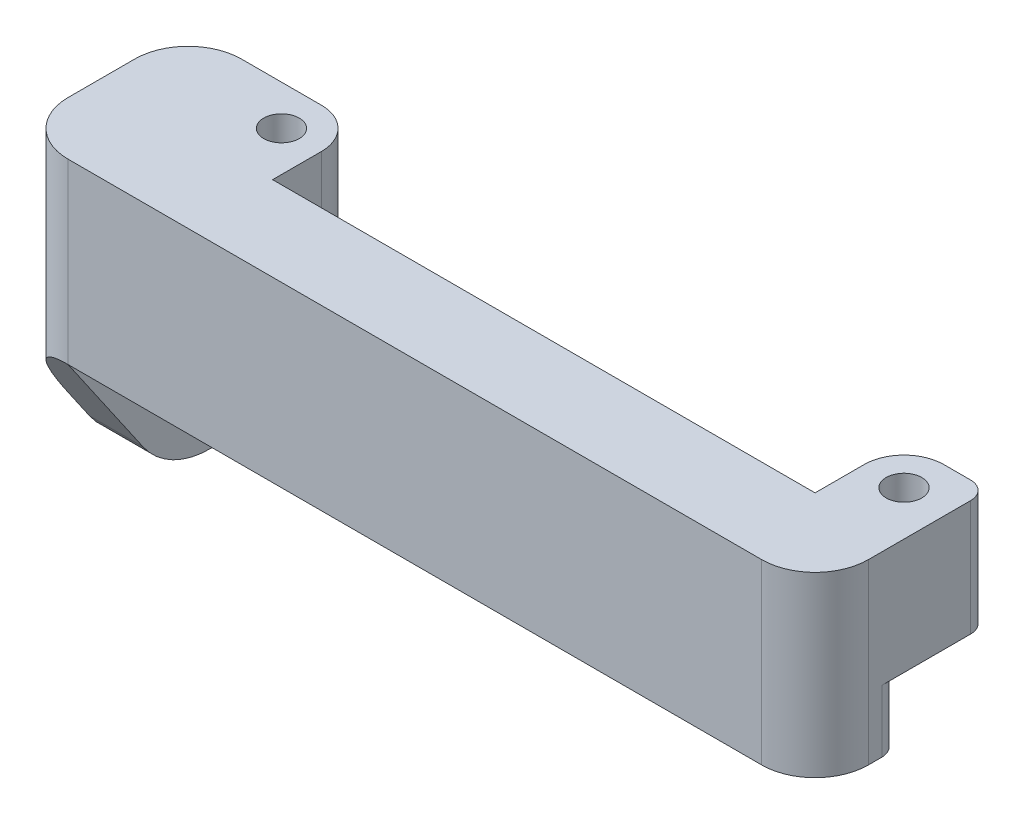
ISO-10303-21;
HEADER;
FILE_DESCRIPTION(('STEP AP214'),'2;1');
FILE_NAME('part.step','',(''),(''),'','','');
FILE_SCHEMA(('AUTOMOTIVE_DESIGN { 1 0 10303 214 1 1 1 1 }'));
ENDSEC;
DATA;
#1=APPLICATION_CONTEXT('core data for automotive mechanical design processes');
#2=APPLICATION_PROTOCOL_DEFINITION('international standard','automotive_design',2000,#1);
#3=PRODUCT_CONTEXT('',#1,'mechanical');
#4=PRODUCT('Part','Part','',(#3));
#5=PRODUCT_RELATED_PRODUCT_CATEGORY('part','',(#4));
#6=PRODUCT_DEFINITION_FORMATION('','',#4);
#7=PRODUCT_DEFINITION_CONTEXT('part definition',#1,'design');
#8=PRODUCT_DEFINITION('design','',#6,#7);
#9=PRODUCT_DEFINITION_SHAPE('','',#8);
#10=(LENGTH_UNIT() NAMED_UNIT(*) SI_UNIT(.MILLI.,.METRE.));
#11=(NAMED_UNIT(*) PLANE_ANGLE_UNIT() SI_UNIT($,.RADIAN.));
#12=(NAMED_UNIT(*) SI_UNIT($,.STERADIAN.) SOLID_ANGLE_UNIT());
#13=UNCERTAINTY_MEASURE_WITH_UNIT(LENGTH_MEASURE(1.E-05),#10,'distance_accuracy_value','');
#14=(GEOMETRIC_REPRESENTATION_CONTEXT(3) GLOBAL_UNCERTAINTY_ASSIGNED_CONTEXT((#13)) GLOBAL_UNIT_ASSIGNED_CONTEXT((#10,
#11,#12)) REPRESENTATION_CONTEXT('',''));
#15=CARTESIAN_POINT('',(0.,0.,0.));
#16=DIRECTION('',(0.,0.,1.));
#17=DIRECTION('',(1.,0.,0.));
#18=AXIS2_PLACEMENT_3D('',#15,#16,#17);
#19=CARTESIAN_POINT('',(0.,0.,2.75));
#20=DIRECTION('',(0.,0.,-1.));
#21=DIRECTION('',(0.,1.,0.));
#22=AXIS2_PLACEMENT_3D('',#19,#20,#21);
#23=PLANE('',#22);
#24=DIRECTION('',(-1.,0.,0.));
#25=VECTOR('',#24,1.);
#26=CARTESIAN_POINT('',(15.25,0.,2.75));
#27=LINE('',#26,#25);
#28=CARTESIAN_POINT('',(19.,0.,2.75));
#29=VERTEX_POINT('',#28);
#30=CARTESIAN_POINT('',(15.25,0.,2.75));
#31=VERTEX_POINT('',#30);
#32=EDGE_CURVE('E187',#29,#31,#27,.T.);
#33=ORIENTED_EDGE('',*,*,#32,.F.);
#34=DIRECTION('',(0.,1.,0.));
#35=VECTOR('',#34,1.);
#36=CARTESIAN_POINT('',(19.,-3.50000000000002,2.75));
#37=LINE('',#36,#35);
#38=CARTESIAN_POINT('',(19.,-3.5,2.75));
#39=VERTEX_POINT('',#38);
#40=EDGE_CURVE('E253',#29,#39,#37,.F.);
#41=ORIENTED_EDGE('',*,*,#40,.T.);
#42=DIRECTION('',(-1.,0.,0.));
#43=VECTOR('',#42,1.);
#44=CARTESIAN_POINT('',(-15.25,-3.5,2.75));
#45=LINE('',#44,#43);
#46=CARTESIAN_POINT('',(-22.,-3.5,2.75));
#47=VERTEX_POINT('',#46);
#48=EDGE_CURVE('E202',#39,#47,#45,.T.);
#49=ORIENTED_EDGE('',*,*,#48,.T.);
#50=DIRECTION('',(0.,1.,0.));
#51=VECTOR('',#50,1.);
#52=CARTESIAN_POINT('',(-22.,-3.5,2.75));
#53=LINE('',#52,#51);
#54=CARTESIAN_POINT('',(-22.,0.,2.75));
#55=VERTEX_POINT('',#54);
#56=EDGE_CURVE('E204',#47,#55,#53,.T.);
#57=ORIENTED_EDGE('',*,*,#56,.T.);
#58=DIRECTION('',(1.,0.,0.));
#59=VECTOR('',#58,1.);
#60=CARTESIAN_POINT('',(-22.,0.,2.75));
#61=LINE('',#60,#59);
#62=CARTESIAN_POINT('',(-15.25,0.,2.75));
#63=VERTEX_POINT('',#62);
#64=EDGE_CURVE('E196',#55,#63,#61,.T.);
#65=ORIENTED_EDGE('',*,*,#64,.T.);
#66=DIRECTION('',(0.,1.,0.));
#67=VECTOR('',#66,1.);
#68=CARTESIAN_POINT('',(-15.25,6.5,2.75));
#69=LINE('',#68,#67);
#70=CARTESIAN_POINT('',(-15.25,6.5,2.75));
#71=VERTEX_POINT('',#70);
#72=EDGE_CURVE('E191',#63,#71,#69,.T.);
#73=ORIENTED_EDGE('',*,*,#72,.T.);
#74=DIRECTION('',(-1.,0.,0.));
#75=VECTOR('',#74,1.);
#76=CARTESIAN_POINT('',(20.,6.49999999999998,2.75));
#77=LINE('',#76,#75);
#78=CARTESIAN_POINT('',(15.25,6.5,2.75));
#79=VERTEX_POINT('',#78);
#80=EDGE_CURVE('E170',#79,#71,#77,.T.);
#81=ORIENTED_EDGE('',*,*,#80,.F.);
#82=DIRECTION('',(0.,1.,0.));
#83=VECTOR('',#82,1.);
#84=CARTESIAN_POINT('',(15.25,6.5,2.75));
#85=LINE('',#84,#83);
#86=EDGE_CURVE('E180',#31,#79,#85,.T.);
#87=ORIENTED_EDGE('',*,*,#86,.F.);
#88=EDGE_LOOP('',(#33,#41,#49,#57,#65,#73,#81,#87));
#89=FACE_BOUND('',#88,.T.);
#90=ADVANCED_FACE('F33',(#89),#23,.T.);
#91=CARTESIAN_POINT('',(-15.25,0.,0.));
#92=DIRECTION('',(-1.,0.,0.));
#93=DIRECTION('',(0.,0.,1.));
#94=AXIS2_PLACEMENT_3D('',#91,#92,#93);
#95=PLANE('',#94);
#96=DIRECTION('',(0.,0.,-1.));
#97=VECTOR('',#96,1.);
#98=CARTESIAN_POINT('',(-15.25,0.,2.75));
#99=LINE('',#98,#97);
#100=CARTESIAN_POINT('',(-15.25,0.,0.));
#101=VERTEX_POINT('',#100);
#102=EDGE_CURVE('E206',#63,#101,#99,.T.);
#103=ORIENTED_EDGE('',*,*,#102,.T.);
#104=DIRECTION('',(0.,1.,0.));
#105=VECTOR('',#104,1.);
#106=CARTESIAN_POINT('',(-15.25,6.5,0.));
#107=LINE('',#106,#105);
#108=CARTESIAN_POINT('',(-15.25,6.5,0.));
#109=VERTEX_POINT('',#108);
#110=EDGE_CURVE('E278',#101,#109,#107,.T.);
#111=ORIENTED_EDGE('',*,*,#110,.T.);
#112=DIRECTION('',(0.,0.,1.));
#113=VECTOR('',#112,1.);
#114=CARTESIAN_POINT('',(-15.25,6.5,7.5));
#115=LINE('',#114,#113);
#116=EDGE_CURVE('E214',#109,#71,#115,.T.);
#117=ORIENTED_EDGE('',*,*,#116,.T.);
#118=ORIENTED_EDGE('',*,*,#72,.F.);
#119=EDGE_LOOP('',(#103,#111,#117,#118));
#120=FACE_BOUND('',#119,.T.);
#121=ADVANCED_FACE('F335',(#120),#95,.F.);
#122=CARTESIAN_POINT('',(-15.25,-3.5,-2.25));
#123=DIRECTION('',(0.,1.,0.));
#124=DIRECTION('',(0.,0.,1.));
#125=AXIS2_PLACEMENT_3D('',#122,#123,#124);
#126=PLANE('',#125);
#127=DIRECTION('',(0.,0.,-1.));
#128=VECTOR('',#127,1.);
#129=CARTESIAN_POINT('',(20.,-3.50000000000002,2.75));
#130=LINE('',#129,#128);
#131=CARTESIAN_POINT('',(20.,-3.50000000000002,4.5));
#132=VERTEX_POINT('',#131);
#133=CARTESIAN_POINT('',(20.,-3.50000000000002,3.75));
#134=VERTEX_POINT('',#133);
#135=EDGE_CURVE('E193',#132,#134,#130,.T.);
#136=ORIENTED_EDGE('',*,*,#135,.F.);
#137=CARTESIAN_POINT('',(17.,-3.5,4.5));
#138=DIRECTION('',(0.,1.,0.));
#139=DIRECTION('',(0.,0.,1.));
#140=AXIS2_PLACEMENT_3D('',#137,#138,#139);
#141=CIRCLE('',#140,3.);
#142=CARTESIAN_POINT('',(17.,-3.5,7.5));
#143=VERTEX_POINT('',#142);
#144=EDGE_CURVE('E288',#132,#143,#141,.F.);
#145=ORIENTED_EDGE('',*,*,#144,.T.);
#146=DIRECTION('',(-1.,0.,0.));
#147=VECTOR('',#146,1.);
#148=CARTESIAN_POINT('',(-15.25,-3.5,7.5));
#149=LINE('',#148,#147);
#150=CARTESIAN_POINT('',(-22.,-3.5,7.5));
#151=VERTEX_POINT('',#150);
#152=EDGE_CURVE('E216',#143,#151,#149,.T.);
#153=ORIENTED_EDGE('',*,*,#152,.T.);
#154=DIRECTION('',(0.,0.,-1.));
#155=VECTOR('',#154,1.);
#156=CARTESIAN_POINT('',(-22.,-3.5,-2.25));
#157=LINE('',#156,#155);
#158=EDGE_CURVE('E211',#151,#47,#157,.T.);
#159=ORIENTED_EDGE('',*,*,#158,.T.);
#160=ORIENTED_EDGE('',*,*,#48,.F.);
#161=CARTESIAN_POINT('',(19.,-3.5,3.75));
#162=DIRECTION('',(0.,1.,0.));
#163=DIRECTION('',(0.,0.,1.));
#164=AXIS2_PLACEMENT_3D('',#161,#162,#163);
#165=CIRCLE('',#164,1.);
#166=EDGE_CURVE('E255',#39,#134,#165,.F.);
#167=ORIENTED_EDGE('',*,*,#166,.T.);
#168=EDGE_LOOP('',(#136,#145,#153,#159,#160,#167));
#169=FACE_BOUND('',#168,.T.);
#170=ADVANCED_FACE('F340',(#169),#126,.F.);
#171=CARTESIAN_POINT('',(-22.,-7.,-0.5));
#172=DIRECTION('',(-1.,0.,0.));
#173=DIRECTION('',(0.,0.,1.));
#174=AXIS2_PLACEMENT_3D('',#171,#172,#173);
#175=PLANE('',#174);
#176=CARTESIAN_POINT('',(-22.,-7.,-0.5));
#177=DIRECTION('',(1.,0.,0.));
#178=DIRECTION('',(0.,0.,-1.));
#179=AXIS2_PLACEMENT_3D('',#176,#177,#178);
#180=CIRCLE('',#179,1.59999999999999);
#181=CARTESIAN_POINT('',(-22.,-7.,-2.09999999999999));
#182=VERTEX_POINT('',#181);
#183=EDGE_CURVE('E431',#182,#182,#180,.T.);
#184=ORIENTED_EDGE('',*,*,#183,.F.);
#185=EDGE_LOOP('',(#184));
#186=FACE_BOUND('',#185,.T.);
#187=DIRECTION('',(0.,-0.902050649941539,-0.431630194657473));
#188=VECTOR('',#187,1.);
#189=CARTESIAN_POINT('',(-22.,0.,-2.25));
#190=LINE('',#189,#188);
#191=CARTESIAN_POINT('',(-22.,0.,-2.25));
#192=VERTEX_POINT('',#191);
#193=CARTESIAN_POINT('',(-22.,-5.01450110457563,-4.64943298973108));
#194=VERTEX_POINT('',#193);
#195=EDGE_CURVE('E222',#192,#194,#190,.T.);
#196=ORIENTED_EDGE('',*,*,#195,.F.);
#197=DIRECTION('',(0.,0.,-1.));
#198=VECTOR('',#197,1.);
#199=CARTESIAN_POINT('',(-22.,0.,2.75));
#200=LINE('',#199,#198);
#201=EDGE_CURVE('E208',#55,#192,#200,.T.);
#202=ORIENTED_EDGE('',*,*,#201,.F.);
#203=ORIENTED_EDGE('',*,*,#56,.F.);
#204=ORIENTED_EDGE('',*,*,#158,.F.);
#205=DIRECTION('',(0.,0.823317027142543,0.567581776325813));
#206=VECTOR('',#205,1.);
#207=CARTESIAN_POINT('',(-22.,-9.61087617109874,3.2872583248557));
#208=LINE('',#207,#206);
#209=CARTESIAN_POINT('',(-22.,-9.61087617109874,3.2872583248557));
#210=VERTEX_POINT('',#209);
#211=EDGE_CURVE('E229',#210,#151,#208,.T.);
#212=ORIENTED_EDGE('',*,*,#211,.F.);
#213=CARTESIAN_POINT('',(-22.,-7.,-0.5));
#214=DIRECTION('',(-1.,0.,0.));
#215=DIRECTION('',(0.,0.,1.));
#216=AXIS2_PLACEMENT_3D('',#213,#214,#215);
#217=CIRCLE('',#216,4.6);
#218=EDGE_CURVE('E225',#194,#210,#217,.T.);
#219=ORIENTED_EDGE('',*,*,#218,.F.);
#220=EDGE_LOOP('',(#196,#202,#203,#204,#212,#219));
#221=FACE_BOUND('',#220,.T.);
#222=ADVANCED_FACE('F353',(#186,#221),#175,.F.);
#223=CARTESIAN_POINT('',(-22.,6.5,7.5));
#224=DIRECTION('',(0.,1.,0.));
#225=DIRECTION('',(0.,0.,1.));
#226=AXIS2_PLACEMENT_3D('',#223,#224,#225);
#227=PLANE('',#226);
#228=CARTESIAN_POINT('',(17.5,6.50000000000001,0.));
#229=DIRECTION('',(0.,-1.,0.));
#230=DIRECTION('',(0.,0.,-1.));
#231=AXIS2_PLACEMENT_3D('',#228,#229,#230);
#232=CIRCLE('',#231,0.999999999999987);
#233=CARTESIAN_POINT('',(17.5,6.50000000000001,-0.999999999999987));
#234=VERTEX_POINT('',#233);
#235=EDGE_CURVE('E422',#234,#234,#232,.T.);
#236=ORIENTED_EDGE('',*,*,#235,.T.);
#237=EDGE_LOOP('',(#236));
#238=FACE_BOUND('',#237,.T.);
#239=CARTESIAN_POINT('',(-17.5,6.50000000000001,0.));
#240=DIRECTION('',(0.,-1.,0.));
#241=DIRECTION('',(0.,0.,-1.));
#242=AXIS2_PLACEMENT_3D('',#239,#240,#241);
#243=CIRCLE('',#242,0.999999999999987);
#244=CARTESIAN_POINT('',(-17.5,6.50000000000001,-0.999999999999987));
#245=VERTEX_POINT('',#244);
#246=EDGE_CURVE('E188',#245,#245,#243,.T.);
#247=ORIENTED_EDGE('',*,*,#246,.T.);
#248=EDGE_LOOP('',(#247));
#249=FACE_BOUND('',#248,.T.);
#250=DIRECTION('',(-1.,0.,0.));
#251=VECTOR('',#250,1.);
#252=CARTESIAN_POINT('',(-22.,6.5,7.5));
#253=LINE('',#252,#251);
#254=CARTESIAN_POINT('',(17.,6.5,7.5));
#255=VERTEX_POINT('',#254);
#256=CARTESIAN_POINT('',(-22.,6.5,7.5));
#257=VERTEX_POINT('',#256);
#258=EDGE_CURVE('E239',#255,#257,#253,.T.);
#259=ORIENTED_EDGE('',*,*,#258,.F.);
#260=CARTESIAN_POINT('',(17.,6.5,4.5));
#261=DIRECTION('',(0.,1.,0.));
#262=DIRECTION('',(0.,0.,1.));
#263=AXIS2_PLACEMENT_3D('',#260,#261,#262);
#264=CIRCLE('',#263,3.);
#265=CARTESIAN_POINT('',(20.,6.49999999999998,4.5));
#266=VERTEX_POINT('',#265);
#267=EDGE_CURVE('E298',#255,#266,#264,.T.);
#268=ORIENTED_EDGE('',*,*,#267,.T.);
#269=DIRECTION('',(0.,0.,1.));
#270=VECTOR('',#269,1.);
#271=CARTESIAN_POINT('',(20.,6.49999999999998,7.5));
#272=LINE('',#271,#270);
#273=CARTESIAN_POINT('',(20.,6.49999999999998,-1.25));
#274=VERTEX_POINT('',#273);
#275=EDGE_CURVE('E176',#274,#266,#272,.T.);
#276=ORIENTED_EDGE('',*,*,#275,.F.);
#277=CARTESIAN_POINT('',(19.,6.5,-1.25));
#278=DIRECTION('',(0.,1.,0.));
#279=DIRECTION('',(0.,0.,1.));
#280=AXIS2_PLACEMENT_3D('',#277,#278,#279);
#281=CIRCLE('',#280,1.);
#282=CARTESIAN_POINT('',(19.,6.5,-2.25));
#283=VERTEX_POINT('',#282);
#284=EDGE_CURVE('E263',#274,#283,#281,.T.);
#285=ORIENTED_EDGE('',*,*,#284,.T.);
#286=DIRECTION('',(1.,0.,0.));
#287=VECTOR('',#286,1.);
#288=CARTESIAN_POINT('',(20.,6.5,-2.25));
#289=LINE('',#288,#287);
#290=CARTESIAN_POINT('',(17.5,6.5,-2.25));
#291=VERTEX_POINT('',#290);
#292=EDGE_CURVE('E412',#291,#283,#289,.T.);
#293=ORIENTED_EDGE('',*,*,#292,.F.);
#294=CARTESIAN_POINT('',(17.5,6.5,0.));
#295=DIRECTION('',(0.,1.,0.));
#296=DIRECTION('',(0.,0.,1.));
#297=AXIS2_PLACEMENT_3D('',#294,#295,#296);
#298=CIRCLE('',#297,2.25);
#299=CARTESIAN_POINT('',(15.25,6.5,0.));
#300=VERTEX_POINT('',#299);
#301=EDGE_CURVE('E173',#291,#300,#298,.T.);
#302=ORIENTED_EDGE('',*,*,#301,.T.);
#303=DIRECTION('',(0.,0.,1.));
#304=VECTOR('',#303,1.);
#305=CARTESIAN_POINT('',(15.25,6.5,-2.25));
#306=LINE('',#305,#304);
#307=EDGE_CURVE('E164',#300,#79,#306,.T.);
#308=ORIENTED_EDGE('',*,*,#307,.T.);
#309=ORIENTED_EDGE('',*,*,#80,.T.);
#310=ORIENTED_EDGE('',*,*,#116,.F.);
#311=CARTESIAN_POINT('',(-17.5,6.5,0.));
#312=DIRECTION('',(0.,1.,0.));
#313=DIRECTION('',(0.,0.,1.));
#314=AXIS2_PLACEMENT_3D('',#311,#312,#313);
#315=CIRCLE('',#314,2.25);
#316=CARTESIAN_POINT('',(-17.5,6.5,-2.25));
#317=VERTEX_POINT('',#316);
#318=EDGE_CURVE('E271',#109,#317,#315,.T.);
#319=ORIENTED_EDGE('',*,*,#318,.T.);
#320=DIRECTION('',(-1.,0.,0.));
#321=VECTOR('',#320,1.);
#322=CARTESIAN_POINT('',(-22.,6.5,-2.25));
#323=LINE('',#322,#321);
#324=CARTESIAN_POINT('',(-22.,6.5,-2.25));
#325=VERTEX_POINT('',#324);
#326=EDGE_CURVE('E231',#317,#325,#323,.T.);
#327=ORIENTED_EDGE('',*,*,#326,.T.);
#328=CARTESIAN_POINT('',(-22.,6.5,0.750000000000001));
#329=DIRECTION('',(0.,1.,0.));
#330=DIRECTION('',(0.,0.,1.));
#331=AXIS2_PLACEMENT_3D('',#328,#329,#330);
#332=CIRCLE('',#331,3.);
#333=CARTESIAN_POINT('',(-25.,6.5,0.750000000000001));
#334=VERTEX_POINT('',#333);
#335=EDGE_CURVE('E296',#325,#334,#332,.T.);
#336=ORIENTED_EDGE('',*,*,#335,.T.);
#337=DIRECTION('',(0.,0.,-1.));
#338=VECTOR('',#337,1.);
#339=CARTESIAN_POINT('',(-25.,6.5,7.5));
#340=LINE('',#339,#338);
#341=CARTESIAN_POINT('',(-25.,6.5,4.5));
#342=VERTEX_POINT('',#341);
#343=EDGE_CURVE('E221',#342,#334,#340,.T.);
#344=ORIENTED_EDGE('',*,*,#343,.F.);
#345=CARTESIAN_POINT('',(-22.,6.5,4.5));
#346=DIRECTION('',(0.,1.,0.));
#347=DIRECTION('',(0.,0.,1.));
#348=AXIS2_PLACEMENT_3D('',#345,#346,#347);
#349=CIRCLE('',#348,3.);
#350=EDGE_CURVE('E294',#342,#257,#349,.T.);
#351=ORIENTED_EDGE('',*,*,#350,.T.);
#352=EDGE_LOOP('',(#259,#268,#276,#285,#293,#302,#308,#309,#310,#319,#327,#336,#344,#351));
#353=FACE_BOUND('',#352,.T.);
#354=ADVANCED_FACE('F167',(#238,#249,#353),#227,.T.);
#355=CARTESIAN_POINT('',(-22.,-3.5,7.5));
#356=DIRECTION('',(0.,0.,1.));
#357=DIRECTION('',(0.,-1.,0.));
#358=AXIS2_PLACEMENT_3D('',#355,#356,#357);
#359=PLANE('',#358);
#360=ORIENTED_EDGE('',*,*,#152,.F.);
#361=DIRECTION('',(0.,-1.,0.));
#362=VECTOR('',#361,1.);
#363=CARTESIAN_POINT('',(17.,6.49999999999998,7.5));
#364=LINE('',#363,#362);
#365=EDGE_CURVE('E292',#143,#255,#364,.F.);
#366=ORIENTED_EDGE('',*,*,#365,.T.);
#367=ORIENTED_EDGE('',*,*,#258,.T.);
#368=DIRECTION('',(0.,1.,0.));
#369=VECTOR('',#368,1.);
#370=CARTESIAN_POINT('',(-22.,-3.5,7.5));
#371=LINE('',#370,#369);
#372=EDGE_CURVE('E290',#257,#151,#371,.F.);
#373=ORIENTED_EDGE('',*,*,#372,.T.);
#374=EDGE_LOOP('',(#360,#366,#367,#373));
#375=FACE_BOUND('',#374,.T.);
#376=ADVANCED_FACE('F327',(#375),#359,.T.);
#377=CARTESIAN_POINT('',(-22.,-9.61087617109874,3.2872583248557));
#378=DIRECTION('',(0.,-0.567581776325813,0.823317027142543));
#379=DIRECTION('',(0.,-0.823317027142543,-0.567581776325813));
#380=AXIS2_PLACEMENT_3D('',#377,#378,#379);
#381=PLANE('',#380);
#382=ORIENTED_EDGE('',*,*,#211,.T.);
#383=CARTESIAN_POINT('',(-22.,-7.85170962925665,4.5));
#384=DIRECTION('',(0.,-0.567581776325813,0.823317027142543));
#385=DIRECTION('',(0.,0.823317027142543,0.567581776325813));
#386=AXIS2_PLACEMENT_3D('',#383,#384,#385);
#387=ELLIPSE('',#386,5.2855819639246,3.);
#388=CARTESIAN_POINT('',(-25.,-7.85170962925665,4.5));
#389=VERTEX_POINT('',#388);
#390=EDGE_CURVE('E41',#151,#389,#387,.T.);
#391=ORIENTED_EDGE('',*,*,#390,.T.);
#392=DIRECTION('',(0.,0.823317027142543,0.567581776325813));
#393=VECTOR('',#392,1.);
#394=CARTESIAN_POINT('',(-25.,-9.61087617109874,3.2872583248557));
#395=LINE('',#394,#393);
#396=CARTESIAN_POINT('',(-25.,-9.61087617109874,3.2872583248557));
#397=VERTEX_POINT('',#396);
#398=EDGE_CURVE('E226',#397,#389,#395,.T.);
#399=ORIENTED_EDGE('',*,*,#398,.F.);
#400=DIRECTION('',(-1.,0.,0.));
#401=VECTOR('',#400,1.);
#402=CARTESIAN_POINT('',(-22.,-9.61087617109874,3.2872583248557));
#403=LINE('',#402,#401);
#404=EDGE_CURVE('E242',#210,#397,#403,.T.);
#405=ORIENTED_EDGE('',*,*,#404,.F.);
#406=EDGE_LOOP('',(#382,#391,#399,#405));
#407=FACE_BOUND('',#406,.T.);
#408=ADVANCED_FACE('F363',(#407),#381,.T.);
#409=CARTESIAN_POINT('',(-22.,-7.,-0.5));
#410=DIRECTION('',(-1.,0.,0.));
#411=DIRECTION('',(0.,0.,1.));
#412=AXIS2_PLACEMENT_3D('',#409,#410,#411);
#413=CYLINDRICAL_SURFACE('',#412,4.6);
#414=CARTESIAN_POINT('',(-25.,-7.,-0.5));
#415=DIRECTION('',(-1.,0.,0.));
#416=DIRECTION('',(0.,0.,1.));
#417=AXIS2_PLACEMENT_3D('',#414,#415,#416);
#418=CIRCLE('',#417,4.6);
#419=CARTESIAN_POINT('',(-25.,-5.01450110457563,-4.64943298973108));
#420=VERTEX_POINT('',#419);
#421=EDGE_CURVE('E235',#420,#397,#418,.T.);
#422=ORIENTED_EDGE('',*,*,#421,.F.);
#423=DIRECTION('',(-1.,0.,0.));
#424=VECTOR('',#423,1.);
#425=CARTESIAN_POINT('',(-22.,-5.01450110457563,-4.64943298973108));
#426=LINE('',#425,#424);
#427=EDGE_CURVE('E244',#194,#420,#426,.T.);
#428=ORIENTED_EDGE('',*,*,#427,.F.);
#429=ORIENTED_EDGE('',*,*,#218,.T.);
#430=ORIENTED_EDGE('',*,*,#404,.T.);
#431=EDGE_LOOP('',(#422,#428,#429,#430));
#432=FACE_BOUND('',#431,.T.);
#433=ADVANCED_FACE('F366',(#432),#413,.T.);
#434=CARTESIAN_POINT('',(-22.,0.,-2.25));
#435=DIRECTION('',(0.,0.431630194657473,-0.902050649941539));
#436=DIRECTION('',(0.,0.902050649941539,0.431630194657473));
#437=AXIS2_PLACEMENT_3D('',#434,#435,#436);
#438=PLANE('',#437);
#439=DIRECTION('',(0.,-0.902050649941539,-0.431630194657473));
#440=VECTOR('',#439,1.);
#441=CARTESIAN_POINT('',(-25.,0.,-2.25));
#442=LINE('',#441,#440);
#443=CARTESIAN_POINT('',(-25.,6.26960760234147,0.750000000000002));
#444=VERTEX_POINT('',#443);
#445=EDGE_CURVE('E47',#444,#420,#442,.T.);
#446=ORIENTED_EDGE('',*,*,#445,.F.);
#447=CARTESIAN_POINT('',(-22.,6.26960760234147,0.750000000000001));
#448=DIRECTION('',(0.,0.431630194657473,-0.902050649941539));
#449=DIRECTION('',(0.,-0.902050649941539,-0.431630194657473));
#450=AXIS2_PLACEMENT_3D('',#447,#448,#449);
#451=ELLIPSE('',#450,6.95039419654295,3.);
#452=EDGE_CURVE('E11',#444,#192,#451,.F.);
#453=ORIENTED_EDGE('',*,*,#452,.T.);
#454=ORIENTED_EDGE('',*,*,#195,.T.);
#455=ORIENTED_EDGE('',*,*,#427,.T.);
#456=EDGE_LOOP('',(#446,#453,#454,#455));
#457=FACE_BOUND('',#456,.T.);
#458=ADVANCED_FACE('F369',(#457),#438,.T.);
#459=CARTESIAN_POINT('',(-22.,6.5,-2.25));
#460=DIRECTION('',(0.,0.,-1.));
#461=DIRECTION('',(0.,1.,0.));
#462=AXIS2_PLACEMENT_3D('',#459,#460,#461);
#463=PLANE('',#462);
#464=DIRECTION('',(1.,0.,0.));
#465=VECTOR('',#464,1.);
#466=CARTESIAN_POINT('',(-22.,0.,-2.25));
#467=LINE('',#466,#465);
#468=CARTESIAN_POINT('',(-17.5,0.,-2.25));
#469=VERTEX_POINT('',#468);
#470=EDGE_CURVE('E192',#192,#469,#467,.T.);
#471=ORIENTED_EDGE('',*,*,#470,.F.);
#472=DIRECTION('',(0.,-1.,0.));
#473=VECTOR('',#472,1.);
#474=CARTESIAN_POINT('',(-22.,6.5,-2.25));
#475=LINE('',#474,#473);
#476=EDGE_CURVE('E306',#192,#325,#475,.F.);
#477=ORIENTED_EDGE('',*,*,#476,.T.);
#478=ORIENTED_EDGE('',*,*,#326,.F.);
#479=DIRECTION('',(0.,1.,0.));
#480=VECTOR('',#479,1.);
#481=CARTESIAN_POINT('',(-17.5,0.,-2.25));
#482=LINE('',#481,#480);
#483=EDGE_CURVE('E281',#317,#469,#482,.F.);
#484=ORIENTED_EDGE('',*,*,#483,.T.);
#485=EDGE_LOOP('',(#471,#477,#478,#484));
#486=FACE_BOUND('',#485,.T.);
#487=ADVANCED_FACE('F311',(#486),#463,.T.);
#488=CARTESIAN_POINT('',(-25.,-7.,-0.5));
#489=DIRECTION('',(-1.,0.,0.));
#490=DIRECTION('',(0.,0.,1.));
#491=AXIS2_PLACEMENT_3D('',#488,#489,#490);
#492=PLANE('',#491);
#493=CARTESIAN_POINT('',(-25.,-7.,-0.5));
#494=DIRECTION('',(1.,0.,0.));
#495=DIRECTION('',(0.,0.,-1.));
#496=AXIS2_PLACEMENT_3D('',#493,#494,#495);
#497=CIRCLE('',#496,1.59999999999999);
#498=CARTESIAN_POINT('',(-25.,-7.,-2.09999999999999));
#499=VERTEX_POINT('',#498);
#500=EDGE_CURVE('E428',#499,#499,#497,.T.);
#501=ORIENTED_EDGE('',*,*,#500,.T.);
#502=EDGE_LOOP('',(#501));
#503=FACE_BOUND('',#502,.T.);
#504=ORIENTED_EDGE('',*,*,#343,.T.);
#505=DIRECTION('',(0.,-1.,0.));
#506=VECTOR('',#505,1.);
#507=CARTESIAN_POINT('',(-25.,-7.,0.750000000000002));
#508=LINE('',#507,#506);
#509=EDGE_CURVE('E303',#334,#444,#508,.T.);
#510=ORIENTED_EDGE('',*,*,#509,.T.);
#511=ORIENTED_EDGE('',*,*,#445,.T.);
#512=ORIENTED_EDGE('',*,*,#421,.T.);
#513=ORIENTED_EDGE('',*,*,#398,.T.);
#514=DIRECTION('',(0.,1.,0.));
#515=VECTOR('',#514,1.);
#516=CARTESIAN_POINT('',(-25.,-7.,4.5));
#517=LINE('',#516,#515);
#518=EDGE_CURVE('E300',#389,#342,#517,.T.);
#519=ORIENTED_EDGE('',*,*,#518,.T.);
#520=EDGE_LOOP('',(#504,#510,#511,#512,#513,#519));
#521=FACE_BOUND('',#520,.T.);
#522=ADVANCED_FACE('F320',(#503,#521),#492,.T.);
#523=CARTESIAN_POINT('',(-22.,0.,2.75));
#524=DIRECTION('',(0.,1.,0.));
#525=DIRECTION('',(0.,0.,1.));
#526=AXIS2_PLACEMENT_3D('',#523,#524,#525);
#527=PLANE('',#526);
#528=CARTESIAN_POINT('',(-17.5,0.,0.));
#529=DIRECTION('',(0.,-1.,0.));
#530=DIRECTION('',(0.,0.,-1.));
#531=AXIS2_PLACEMENT_3D('',#528,#529,#530);
#532=CIRCLE('',#531,0.999999999999987);
#533=CARTESIAN_POINT('',(-17.5,0.,-0.999999999999987));
#534=VERTEX_POINT('',#533);
#535=EDGE_CURVE('E419',#534,#534,#532,.T.);
#536=ORIENTED_EDGE('',*,*,#535,.F.);
#537=EDGE_LOOP('',(#536));
#538=FACE_BOUND('',#537,.T.);
#539=ORIENTED_EDGE('',*,*,#470,.T.);
#540=CARTESIAN_POINT('',(-17.5,0.,0.));
#541=DIRECTION('',(0.,1.,0.));
#542=DIRECTION('',(0.,0.,1.));
#543=AXIS2_PLACEMENT_3D('',#540,#541,#542);
#544=CIRCLE('',#543,2.25);
#545=EDGE_CURVE('E283',#469,#101,#544,.F.);
#546=ORIENTED_EDGE('',*,*,#545,.T.);
#547=ORIENTED_EDGE('',*,*,#102,.F.);
#548=ORIENTED_EDGE('',*,*,#64,.F.);
#549=ORIENTED_EDGE('',*,*,#201,.T.);
#550=EDGE_LOOP('',(#539,#546,#547,#548,#549));
#551=FACE_BOUND('',#550,.T.);
#552=ADVANCED_FACE('F347',(#538,#551),#527,.F.);
#553=CARTESIAN_POINT('',(20.,0.,0.));
#554=DIRECTION('',(-1.,0.,0.));
#555=DIRECTION('',(0.,-1.,0.));
#556=AXIS2_PLACEMENT_3D('',#553,#554,#555);
#557=PLANE('',#556);
#558=ORIENTED_EDGE('',*,*,#275,.T.);
#559=DIRECTION('',(0.,-1.,0.));
#560=VECTOR('',#559,1.);
#561=CARTESIAN_POINT('',(20.,-3.50000000000002,4.5));
#562=LINE('',#561,#560);
#563=EDGE_CURVE('E285',#266,#132,#562,.T.);
#564=ORIENTED_EDGE('',*,*,#563,.T.);
#565=ORIENTED_EDGE('',*,*,#135,.T.);
#566=DIRECTION('',(0.,1.,0.));
#567=VECTOR('',#566,1.);
#568=CARTESIAN_POINT('',(20.,0.,3.75));
#569=LINE('',#568,#567);
#570=CARTESIAN_POINT('',(20.,0.,3.75));
#571=VERTEX_POINT('',#570);
#572=EDGE_CURVE('E250',#134,#571,#569,.T.);
#573=ORIENTED_EDGE('',*,*,#572,.T.);
#574=DIRECTION('',(0.,0.,1.));
#575=VECTOR('',#574,1.);
#576=CARTESIAN_POINT('',(20.,0.,-2.25));
#577=LINE('',#576,#575);
#578=CARTESIAN_POINT('',(20.,0.,-1.25));
#579=VERTEX_POINT('',#578);
#580=EDGE_CURVE('E177',#579,#571,#577,.T.);
#581=ORIENTED_EDGE('',*,*,#580,.F.);
#582=DIRECTION('',(0.,-1.,0.));
#583=VECTOR('',#582,1.);
#584=CARTESIAN_POINT('',(20.,0.,-1.25));
#585=LINE('',#584,#583);
#586=EDGE_CURVE('E248',#579,#274,#585,.F.);
#587=ORIENTED_EDGE('',*,*,#586,.T.);
#588=EDGE_LOOP('',(#558,#564,#565,#573,#581,#587));
#589=FACE_BOUND('',#588,.T.);
#590=ADVANCED_FACE('F345',(#589),#557,.F.);
#591=CARTESIAN_POINT('',(15.25,6.5,-2.25));
#592=DIRECTION('',(1.,0.,0.));
#593=DIRECTION('',(0.,0.,-1.));
#594=AXIS2_PLACEMENT_3D('',#591,#592,#593);
#595=PLANE('',#594);
#596=ORIENTED_EDGE('',*,*,#307,.F.);
#597=DIRECTION('',(0.,1.,0.));
#598=VECTOR('',#597,1.);
#599=CARTESIAN_POINT('',(15.25,6.5,0.));
#600=LINE('',#599,#598);
#601=CARTESIAN_POINT('',(15.25,0.,0.));
#602=VERTEX_POINT('',#601);
#603=EDGE_CURVE('E274',#300,#602,#600,.F.);
#604=ORIENTED_EDGE('',*,*,#603,.T.);
#605=DIRECTION('',(0.,0.,1.));
#606=VECTOR('',#605,1.);
#607=CARTESIAN_POINT('',(15.25,0.,-2.25));
#608=LINE('',#607,#606);
#609=EDGE_CURVE('E183',#602,#31,#608,.T.);
#610=ORIENTED_EDGE('',*,*,#609,.T.);
#611=ORIENTED_EDGE('',*,*,#86,.T.);
#612=EDGE_LOOP('',(#596,#604,#610,#611));
#613=FACE_BOUND('',#612,.T.);
#614=ADVANCED_FACE('F181',(#613),#595,.F.);
#615=CARTESIAN_POINT('',(15.25,0.,-2.25));
#616=DIRECTION('',(0.,1.,0.));
#617=DIRECTION('',(0.,0.,1.));
#618=AXIS2_PLACEMENT_3D('',#615,#616,#617);
#619=PLANE('',#618);
#620=CARTESIAN_POINT('',(17.5,0.,0.));
#621=DIRECTION('',(0.,-1.,0.));
#622=DIRECTION('',(0.,0.,-1.));
#623=AXIS2_PLACEMENT_3D('',#620,#621,#622);
#624=CIRCLE('',#623,0.999999999999987);
#625=CARTESIAN_POINT('',(17.5,0.,-0.999999999999987));
#626=VERTEX_POINT('',#625);
#627=EDGE_CURVE('E425',#626,#626,#624,.T.);
#628=ORIENTED_EDGE('',*,*,#627,.F.);
#629=EDGE_LOOP('',(#628));
#630=FACE_BOUND('',#629,.T.);
#631=ORIENTED_EDGE('',*,*,#609,.F.);
#632=CARTESIAN_POINT('',(17.5,0.,0.));
#633=DIRECTION('',(0.,1.,0.));
#634=DIRECTION('',(0.,0.,1.));
#635=AXIS2_PLACEMENT_3D('',#632,#633,#634);
#636=CIRCLE('',#635,2.25);
#637=CARTESIAN_POINT('',(17.5,0.,-2.25));
#638=VERTEX_POINT('',#637);
#639=EDGE_CURVE('E276',#602,#638,#636,.F.);
#640=ORIENTED_EDGE('',*,*,#639,.T.);
#641=DIRECTION('',(-1.,0.,0.));
#642=VECTOR('',#641,1.);
#643=CARTESIAN_POINT('',(15.25,0.,-2.25));
#644=LINE('',#643,#642);
#645=CARTESIAN_POINT('',(19.,0.,-2.25));
#646=VERTEX_POINT('',#645);
#647=EDGE_CURVE('E411',#646,#638,#644,.T.);
#648=ORIENTED_EDGE('',*,*,#647,.F.);
#649=CARTESIAN_POINT('',(19.,0.,-1.25));
#650=DIRECTION('',(0.,1.,0.));
#651=DIRECTION('',(0.,0.,1.));
#652=AXIS2_PLACEMENT_3D('',#649,#650,#651);
#653=CIRCLE('',#652,1.);
#654=EDGE_CURVE('E261',#646,#579,#653,.F.);
#655=ORIENTED_EDGE('',*,*,#654,.T.);
#656=ORIENTED_EDGE('',*,*,#580,.T.);
#657=CARTESIAN_POINT('',(19.,0.,3.75));
#658=DIRECTION('',(0.,1.,0.));
#659=DIRECTION('',(0.,0.,1.));
#660=AXIS2_PLACEMENT_3D('',#657,#658,#659);
#661=CIRCLE('',#660,1.);
#662=EDGE_CURVE('E266',#571,#29,#661,.T.);
#663=ORIENTED_EDGE('',*,*,#662,.T.);
#664=ORIENTED_EDGE('',*,*,#32,.T.);
#665=EDGE_LOOP('',(#631,#640,#648,#655,#656,#663,#664));
#666=FACE_BOUND('',#665,.T.);
#667=ADVANCED_FACE('F451',(#630,#666),#619,.F.);
#668=CARTESIAN_POINT('',(0.,0.,-2.25));
#669=DIRECTION('',(0.,0.,1.));
#670=DIRECTION('',(1.,0.,0.));
#671=AXIS2_PLACEMENT_3D('',#668,#669,#670);
#672=PLANE('',#671);
#673=ORIENTED_EDGE('',*,*,#647,.T.);
#674=DIRECTION('',(0.,1.,0.));
#675=VECTOR('',#674,1.);
#676=CARTESIAN_POINT('',(17.5,0.,-2.25));
#677=LINE('',#676,#675);
#678=EDGE_CURVE('E268',#638,#291,#677,.T.);
#679=ORIENTED_EDGE('',*,*,#678,.T.);
#680=ORIENTED_EDGE('',*,*,#292,.T.);
#681=DIRECTION('',(0.,-1.,0.));
#682=VECTOR('',#681,1.);
#683=CARTESIAN_POINT('',(19.,0.,-2.25));
#684=LINE('',#683,#682);
#685=EDGE_CURVE('E258',#283,#646,#684,.T.);
#686=ORIENTED_EDGE('',*,*,#685,.T.);
#687=EDGE_LOOP('',(#673,#679,#680,#686));
#688=FACE_BOUND('',#687,.T.);
#689=ADVANCED_FACE('F455',(#688),#672,.F.);
#690=CARTESIAN_POINT('',(-17.5,0.,0.));
#691=DIRECTION('',(0.,-1.,0.));
#692=DIRECTION('',(0.,0.,-1.));
#693=AXIS2_PLACEMENT_3D('',#690,#691,#692);
#694=CYLINDRICAL_SURFACE('',#693,0.999999999999987);
#695=ORIENTED_EDGE('',*,*,#246,.F.);
#696=EDGE_LOOP('',(#695));
#697=FACE_BOUND('',#696,.T.);
#698=ORIENTED_EDGE('',*,*,#535,.T.);
#699=EDGE_LOOP('',(#698));
#700=FACE_BOUND('',#699,.T.);
#701=ADVANCED_FACE('F459',(#697,#700),#694,.F.);
#702=CARTESIAN_POINT('',(17.5,0.,0.));
#703=DIRECTION('',(0.,-1.,0.));
#704=DIRECTION('',(0.,0.,-1.));
#705=AXIS2_PLACEMENT_3D('',#702,#703,#704);
#706=CYLINDRICAL_SURFACE('',#705,0.999999999999987);
#707=ORIENTED_EDGE('',*,*,#235,.F.);
#708=EDGE_LOOP('',(#707));
#709=FACE_BOUND('',#708,.T.);
#710=ORIENTED_EDGE('',*,*,#627,.T.);
#711=EDGE_LOOP('',(#710));
#712=FACE_BOUND('',#711,.T.);
#713=ADVANCED_FACE('F465',(#709,#712),#706,.F.);
#714=CARTESIAN_POINT('',(-22.,-7.,-0.5));
#715=DIRECTION('',(1.,0.,0.));
#716=DIRECTION('',(0.,0.,-1.));
#717=AXIS2_PLACEMENT_3D('',#714,#715,#716);
#718=CYLINDRICAL_SURFACE('',#717,1.59999999999999);
#719=ORIENTED_EDGE('',*,*,#500,.F.);
#720=EDGE_LOOP('',(#719));
#721=FACE_BOUND('',#720,.T.);
#722=ORIENTED_EDGE('',*,*,#183,.T.);
#723=EDGE_LOOP('',(#722));
#724=FACE_BOUND('',#723,.T.);
#725=ADVANCED_FACE('F382',(#721,#724),#718,.F.);
#726=CARTESIAN_POINT('',(19.,0.,3.75));
#727=DIRECTION('',(0.,-1.,0.));
#728=DIRECTION('',(1.,0.,0.));
#729=AXIS2_PLACEMENT_3D('',#726,#727,#728);
#730=CYLINDRICAL_SURFACE('',#729,1.);
#731=ORIENTED_EDGE('',*,*,#166,.F.);
#732=ORIENTED_EDGE('',*,*,#40,.F.);
#733=ORIENTED_EDGE('',*,*,#662,.F.);
#734=ORIENTED_EDGE('',*,*,#572,.F.);
#735=EDGE_LOOP('',(#731,#732,#733,#734));
#736=FACE_BOUND('',#735,.T.);
#737=ADVANCED_FACE('F378',(#736),#730,.T.);
#738=CARTESIAN_POINT('',(19.,0.,-1.25));
#739=DIRECTION('',(0.,-1.,0.));
#740=DIRECTION('',(1.,0.,0.));
#741=AXIS2_PLACEMENT_3D('',#738,#739,#740);
#742=CYLINDRICAL_SURFACE('',#741,1.);
#743=ORIENTED_EDGE('',*,*,#284,.F.);
#744=ORIENTED_EDGE('',*,*,#586,.F.);
#745=ORIENTED_EDGE('',*,*,#654,.F.);
#746=ORIENTED_EDGE('',*,*,#685,.F.);
#747=EDGE_LOOP('',(#743,#744,#745,#746));
#748=FACE_BOUND('',#747,.T.);
#749=ADVANCED_FACE('F381',(#748),#742,.T.);
#750=CARTESIAN_POINT('',(17.5,0.,0.));
#751=DIRECTION('',(0.,1.,0.));
#752=DIRECTION('',(0.,0.,1.));
#753=AXIS2_PLACEMENT_3D('',#750,#751,#752);
#754=CYLINDRICAL_SURFACE('',#753,2.25);
#755=ORIENTED_EDGE('',*,*,#639,.F.);
#756=ORIENTED_EDGE('',*,*,#603,.F.);
#757=ORIENTED_EDGE('',*,*,#301,.F.);
#758=ORIENTED_EDGE('',*,*,#678,.F.);
#759=EDGE_LOOP('',(#755,#756,#757,#758));
#760=FACE_BOUND('',#759,.T.);
#761=ADVANCED_FACE('F386',(#760),#754,.T.);
#762=CARTESIAN_POINT('',(-17.5,0.,0.));
#763=DIRECTION('',(0.,-1.,0.));
#764=DIRECTION('',(0.,0.,-1.));
#765=AXIS2_PLACEMENT_3D('',#762,#763,#764);
#766=CYLINDRICAL_SURFACE('',#765,2.25);
#767=ORIENTED_EDGE('',*,*,#545,.F.);
#768=ORIENTED_EDGE('',*,*,#483,.F.);
#769=ORIENTED_EDGE('',*,*,#318,.F.);
#770=ORIENTED_EDGE('',*,*,#110,.F.);
#771=EDGE_LOOP('',(#767,#768,#769,#770));
#772=FACE_BOUND('',#771,.T.);
#773=ADVANCED_FACE('F390',(#772),#766,.T.);
#774=CARTESIAN_POINT('',(17.,0.,4.5));
#775=DIRECTION('',(0.,1.,0.));
#776=DIRECTION('',(-1.,0.,0.));
#777=AXIS2_PLACEMENT_3D('',#774,#775,#776);
#778=CYLINDRICAL_SURFACE('',#777,3.);
#779=ORIENTED_EDGE('',*,*,#267,.F.);
#780=ORIENTED_EDGE('',*,*,#365,.F.);
#781=ORIENTED_EDGE('',*,*,#144,.F.);
#782=ORIENTED_EDGE('',*,*,#563,.F.);
#783=EDGE_LOOP('',(#779,#780,#781,#782));
#784=FACE_BOUND('',#783,.T.);
#785=ADVANCED_FACE('F333',(#784),#778,.T.);
#786=CARTESIAN_POINT('',(-22.,-7.,0.750000000000002));
#787=DIRECTION('',(0.,-1.,0.));
#788=DIRECTION('',(0.,0.,-1.));
#789=AXIS2_PLACEMENT_3D('',#786,#787,#788);
#790=CYLINDRICAL_SURFACE('',#789,3.);
#791=ORIENTED_EDGE('',*,*,#335,.F.);
#792=ORIENTED_EDGE('',*,*,#476,.F.);
#793=ORIENTED_EDGE('',*,*,#452,.F.);
#794=ORIENTED_EDGE('',*,*,#509,.F.);
#795=EDGE_LOOP('',(#791,#792,#793,#794));
#796=FACE_BOUND('',#795,.T.);
#797=ADVANCED_FACE('F318',(#796),#790,.T.);
#798=CARTESIAN_POINT('',(-22.,-7.,4.5));
#799=DIRECTION('',(0.,1.,0.));
#800=DIRECTION('',(0.,0.,1.));
#801=AXIS2_PLACEMENT_3D('',#798,#799,#800);
#802=CYLINDRICAL_SURFACE('',#801,3.);
#803=ORIENTED_EDGE('',*,*,#390,.F.);
#804=ORIENTED_EDGE('',*,*,#372,.F.);
#805=ORIENTED_EDGE('',*,*,#350,.F.);
#806=ORIENTED_EDGE('',*,*,#518,.F.);
#807=EDGE_LOOP('',(#803,#804,#805,#806));
#808=FACE_BOUND('',#807,.T.);
#809=ADVANCED_FACE('F35',(#808),#802,.T.);
#810=CLOSED_SHELL('',(#90,#121,#170,#222,#354,#376,#408,#433,#458,#487,#522,#552,#590,#614,#667,
#689,#701,#713,#725,#737,#749,#761,#773,#785,#797,#809));
#811=MANIFOLD_SOLID_BREP('B2',#810);
#812=ADVANCED_BREP_SHAPE_REPRESENTATION('',(#18,#811),#14);
#813=SHAPE_DEFINITION_REPRESENTATION(#9,#812);
ENDSEC;
END-ISO-10303-21;
